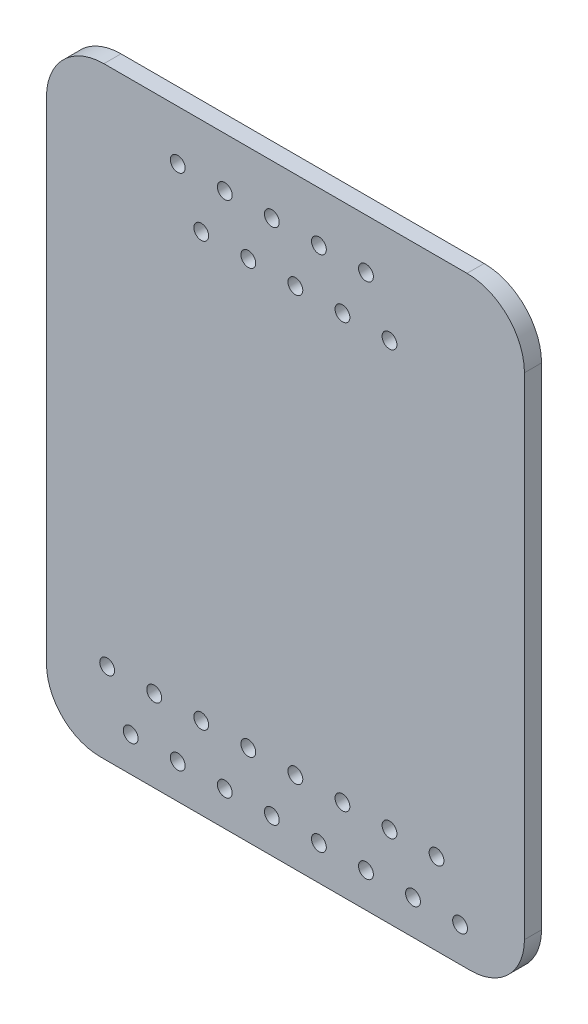
ISO-10303-21;
HEADER;
FILE_DESCRIPTION(('STEP AP214'),'2;1');
FILE_NAME('part.step','',(''),(''),'','','');
FILE_SCHEMA(('AUTOMOTIVE_DESIGN { 1 0 10303 214 1 1 1 1 }'));
ENDSEC;
DATA;
#1=APPLICATION_CONTEXT('core data for automotive mechanical design processes');
#2=APPLICATION_PROTOCOL_DEFINITION('international standard','automotive_design',2000,#1);
#3=PRODUCT_CONTEXT('',#1,'mechanical');
#4=PRODUCT('Part','Part','',(#3));
#5=PRODUCT_RELATED_PRODUCT_CATEGORY('part','',(#4));
#6=PRODUCT_DEFINITION_FORMATION('','',#4);
#7=PRODUCT_DEFINITION_CONTEXT('part definition',#1,'design');
#8=PRODUCT_DEFINITION('design','',#6,#7);
#9=PRODUCT_DEFINITION_SHAPE('','',#8);
#10=(LENGTH_UNIT() NAMED_UNIT(*) SI_UNIT(.MILLI.,.METRE.));
#11=(NAMED_UNIT(*) PLANE_ANGLE_UNIT() SI_UNIT($,.RADIAN.));
#12=(NAMED_UNIT(*) SI_UNIT($,.STERADIAN.) SOLID_ANGLE_UNIT());
#13=UNCERTAINTY_MEASURE_WITH_UNIT(LENGTH_MEASURE(1.E-05),#10,'distance_accuracy_value','');
#14=(GEOMETRIC_REPRESENTATION_CONTEXT(3) GLOBAL_UNCERTAINTY_ASSIGNED_CONTEXT((#13)) GLOBAL_UNIT_ASSIGNED_CONTEXT((#10,
#11,#12)) REPRESENTATION_CONTEXT('',''));
#15=CARTESIAN_POINT('',(0.,0.,0.));
#16=DIRECTION('',(0.,0.,1.));
#17=DIRECTION('',(1.,0.,0.));
#18=AXIS2_PLACEMENT_3D('',#15,#16,#17);
#19=CARTESIAN_POINT('',(6.1,2.9,0.9224));
#20=DIRECTION('',(0.,0.,-1.));
#21=DIRECTION('',(-1.,0.,0.));
#22=AXIS2_PLACEMENT_3D('',#19,#20,#21);
#23=CYLINDRICAL_SURFACE('',#22,2.9);
#24=CARTESIAN_POINT('',(6.1,2.9,0.));
#25=DIRECTION('',(0.,0.,1.));
#26=DIRECTION('',(1.,0.,0.));
#27=AXIS2_PLACEMENT_3D('',#24,#25,#26);
#28=CIRCLE('',#27,2.9);
#29=CARTESIAN_POINT('',(3.2,2.9,0.));
#30=VERTEX_POINT('',#29);
#31=CARTESIAN_POINT('',(6.1,0.,0.));
#32=VERTEX_POINT('',#31);
#33=EDGE_CURVE('E146',#30,#32,#28,.T.);
#34=ORIENTED_EDGE('',*,*,#33,.T.);
#35=DIRECTION('',(0.,0.,-1.));
#36=VECTOR('',#35,1.);
#37=CARTESIAN_POINT('',(6.1,0.,0.9224));
#38=LINE('',#37,#36);
#39=CARTESIAN_POINT('',(6.1,0.,0.9224));
#40=VERTEX_POINT('',#39);
#41=EDGE_CURVE('E11',#40,#32,#38,.T.);
#42=ORIENTED_EDGE('',*,*,#41,.F.);
#43=CARTESIAN_POINT('',(6.1,2.9,0.9224));
#44=DIRECTION('',(0.,0.,1.));
#45=DIRECTION('',(1.,0.,0.));
#46=AXIS2_PLACEMENT_3D('',#43,#44,#45);
#47=CIRCLE('',#46,2.9);
#48=CARTESIAN_POINT('',(3.2,2.9,0.9224));
#49=VERTEX_POINT('',#48);
#50=EDGE_CURVE('E169',#49,#40,#47,.T.);
#51=ORIENTED_EDGE('',*,*,#50,.F.);
#52=DIRECTION('',(0.,0.,-1.));
#53=VECTOR('',#52,1.);
#54=CARTESIAN_POINT('',(3.2,2.9,0.9224));
#55=LINE('',#54,#53);
#56=EDGE_CURVE('E142',#49,#30,#55,.T.);
#57=ORIENTED_EDGE('',*,*,#56,.T.);
#58=EDGE_LOOP('',(#34,#42,#51,#57));
#59=FACE_BOUND('',#58,.T.);
#60=ADVANCED_FACE('F45',(#59),#23,.T.);
#61=CARTESIAN_POINT('',(6.1,0.,0.9224));
#62=DIRECTION('',(0.,1.,0.));
#63=DIRECTION('',(0.,0.,1.));
#64=AXIS2_PLACEMENT_3D('',#61,#62,#63);
#65=PLANE('',#64);
#66=DIRECTION('',(1.,0.,0.));
#67=VECTOR('',#66,1.);
#68=CARTESIAN_POINT('',(6.1,0.,0.));
#69=LINE('',#68,#67);
#70=CARTESIAN_POINT('',(26.1,0.,0.));
#71=VERTEX_POINT('',#70);
#72=EDGE_CURVE('E150',#32,#71,#69,.T.);
#73=ORIENTED_EDGE('',*,*,#72,.T.);
#74=DIRECTION('',(0.,0.,-1.));
#75=VECTOR('',#74,1.);
#76=CARTESIAN_POINT('',(26.1,0.,0.9224));
#77=LINE('',#76,#75);
#78=CARTESIAN_POINT('',(26.1,0.,0.9224));
#79=VERTEX_POINT('',#78);
#80=EDGE_CURVE('E54',#79,#71,#77,.T.);
#81=ORIENTED_EDGE('',*,*,#80,.F.);
#82=DIRECTION('',(1.,0.,0.));
#83=VECTOR('',#82,1.);
#84=CARTESIAN_POINT('',(6.1,0.,0.9224));
#85=LINE('',#84,#83);
#86=EDGE_CURVE('E105',#40,#79,#85,.T.);
#87=ORIENTED_EDGE('',*,*,#86,.F.);
#88=ORIENTED_EDGE('',*,*,#41,.T.);
#89=EDGE_LOOP('',(#73,#81,#87,#88));
#90=FACE_BOUND('',#89,.T.);
#91=ADVANCED_FACE('F490',(#90),#65,.F.);
#92=CARTESIAN_POINT('',(26.10001,2.89998999998276,0.9224));
#93=DIRECTION('',(0.,0.,-1.));
#94=DIRECTION('',(-1.,0.,0.));
#95=AXIS2_PLACEMENT_3D('',#92,#93,#94);
#96=CYLINDRICAL_SURFACE('',#95,2.89999);
#97=CARTESIAN_POINT('',(26.10001,2.89998999998276,0.));
#98=DIRECTION('',(0.,0.,1.));
#99=DIRECTION('',(1.,0.,0.));
#100=AXIS2_PLACEMENT_3D('',#97,#98,#99);
#101=CIRCLE('',#100,2.89999);
#102=CARTESIAN_POINT('',(29.,2.89998999998276,0.));
#103=VERTEX_POINT('',#102);
#104=EDGE_CURVE('E154',#71,#103,#101,.T.);
#105=ORIENTED_EDGE('',*,*,#104,.T.);
#106=DIRECTION('',(0.,0.,-1.));
#107=VECTOR('',#106,1.);
#108=CARTESIAN_POINT('',(29.,2.89998999998276,0.9224));
#109=LINE('',#108,#107);
#110=CARTESIAN_POINT('',(29.,2.89998999998276,0.9224));
#111=VERTEX_POINT('',#110);
#112=EDGE_CURVE('E180',#111,#103,#109,.T.);
#113=ORIENTED_EDGE('',*,*,#112,.F.);
#114=CARTESIAN_POINT('',(26.10001,2.89998999998276,0.9224));
#115=DIRECTION('',(0.,0.,1.));
#116=DIRECTION('',(1.,0.,0.));
#117=AXIS2_PLACEMENT_3D('',#114,#115,#116);
#118=CIRCLE('',#117,2.89999);
#119=EDGE_CURVE('E190',#79,#111,#118,.T.);
#120=ORIENTED_EDGE('',*,*,#119,.F.);
#121=ORIENTED_EDGE('',*,*,#80,.T.);
#122=EDGE_LOOP('',(#105,#113,#120,#121));
#123=FACE_BOUND('',#122,.T.);
#124=ADVANCED_FACE('F188',(#123),#96,.T.);
#125=CARTESIAN_POINT('',(29.,2.89999,0.9224));
#126=DIRECTION('',(-1.,0.,0.));
#127=DIRECTION('',(0.,0.,1.));
#128=AXIS2_PLACEMENT_3D('',#125,#126,#127);
#129=PLANE('',#128);
#130=DIRECTION('',(0.,1.,0.));
#131=VECTOR('',#130,1.);
#132=CARTESIAN_POINT('',(29.,2.89999,0.));
#133=LINE('',#132,#131);
#134=CARTESIAN_POINT('',(29.,29.4,0.));
#135=VERTEX_POINT('',#134);
#136=EDGE_CURVE('E157',#103,#135,#133,.T.);
#137=ORIENTED_EDGE('',*,*,#136,.T.);
#138=DIRECTION('',(0.,0.,-1.));
#139=VECTOR('',#138,1.);
#140=CARTESIAN_POINT('',(29.,29.4,0.9224));
#141=LINE('',#140,#139);
#142=CARTESIAN_POINT('',(29.,29.4,0.9224));
#143=VERTEX_POINT('',#142);
#144=EDGE_CURVE('E176',#143,#135,#141,.T.);
#145=ORIENTED_EDGE('',*,*,#144,.F.);
#146=DIRECTION('',(0.,1.,0.));
#147=VECTOR('',#146,1.);
#148=CARTESIAN_POINT('',(29.,2.89999,0.9224));
#149=LINE('',#148,#147);
#150=EDGE_CURVE('E203',#111,#143,#149,.T.);
#151=ORIENTED_EDGE('',*,*,#150,.F.);
#152=ORIENTED_EDGE('',*,*,#112,.T.);
#153=EDGE_LOOP('',(#137,#145,#151,#152));
#154=FACE_BOUND('',#153,.T.);
#155=ADVANCED_FACE('F198',(#154),#129,.F.);
#156=CARTESIAN_POINT('',(25.9000100000161,29.4000100000161,0.9224));
#157=DIRECTION('',(0.,0.,-1.));
#158=DIRECTION('',(-1.,0.,0.));
#159=AXIS2_PLACEMENT_3D('',#156,#157,#158);
#160=CYLINDRICAL_SURFACE('',#159,3.09999);
#161=CARTESIAN_POINT('',(25.9000100000161,29.4000100000161,0.));
#162=DIRECTION('',(0.,0.,1.));
#163=DIRECTION('',(1.,0.,0.));
#164=AXIS2_PLACEMENT_3D('',#161,#162,#163);
#165=CIRCLE('',#164,3.09999);
#166=CARTESIAN_POINT('',(25.9,32.5,0.));
#167=VERTEX_POINT('',#166);
#168=EDGE_CURVE('E160',#135,#167,#165,.T.);
#169=ORIENTED_EDGE('',*,*,#168,.T.);
#170=DIRECTION('',(0.,0.,-1.));
#171=VECTOR('',#170,1.);
#172=CARTESIAN_POINT('',(25.9,32.5,0.9224));
#173=LINE('',#172,#171);
#174=CARTESIAN_POINT('',(25.9,32.5,0.9224));
#175=VERTEX_POINT('',#174);
#176=EDGE_CURVE('E135',#175,#167,#173,.T.);
#177=ORIENTED_EDGE('',*,*,#176,.F.);
#178=CARTESIAN_POINT('',(25.9000100000161,29.4000100000161,0.9224));
#179=DIRECTION('',(0.,0.,1.));
#180=DIRECTION('',(1.,0.,0.));
#181=AXIS2_PLACEMENT_3D('',#178,#179,#180);
#182=CIRCLE('',#181,3.09999);
#183=EDGE_CURVE('E124',#143,#175,#182,.T.);
#184=ORIENTED_EDGE('',*,*,#183,.F.);
#185=ORIENTED_EDGE('',*,*,#144,.T.);
#186=EDGE_LOOP('',(#169,#177,#184,#185));
#187=FACE_BOUND('',#186,.T.);
#188=ADVANCED_FACE('F201',(#187),#160,.T.);
#189=CARTESIAN_POINT('',(25.9,32.5,0.9224));
#190=DIRECTION('',(5.10203821409991E-07,-0.99999999999987,0.));
#191=DIRECTION('',(0.99999999999987,5.10203821409991E-07,0.));
#192=AXIS2_PLACEMENT_3D('',#189,#190,#191);
#193=PLANE('',#192);
#194=DIRECTION('',(-0.99999999999987,-5.10203821409991E-07,0.));
#195=VECTOR('',#194,1.);
#196=CARTESIAN_POINT('',(25.9,32.5,0.));
#197=LINE('',#196,#195);
#198=CARTESIAN_POINT('',(6.29999,32.49999,0.));
#199=VERTEX_POINT('',#198);
#200=EDGE_CURVE('E133',#167,#199,#197,.T.);
#201=ORIENTED_EDGE('',*,*,#200,.T.);
#202=DIRECTION('',(0.,0.,-1.));
#203=VECTOR('',#202,1.);
#204=CARTESIAN_POINT('',(6.29999,32.49999,0.9224));
#205=LINE('',#204,#203);
#206=CARTESIAN_POINT('',(6.29999,32.49999,0.9224));
#207=VERTEX_POINT('',#206);
#208=EDGE_CURVE('E130',#207,#199,#205,.T.);
#209=ORIENTED_EDGE('',*,*,#208,.F.);
#210=DIRECTION('',(-0.99999999999987,-5.10203821409991E-07,0.));
#211=VECTOR('',#210,1.);
#212=CARTESIAN_POINT('',(25.9,32.5,0.9224));
#213=LINE('',#212,#211);
#214=EDGE_CURVE('E118',#175,#207,#213,.T.);
#215=ORIENTED_EDGE('',*,*,#214,.F.);
#216=ORIENTED_EDGE('',*,*,#176,.T.);
#217=EDGE_LOOP('',(#201,#209,#215,#216));
#218=FACE_BOUND('',#217,.T.);
#219=ADVANCED_FACE('F131',(#218),#193,.F.);
#220=CARTESIAN_POINT('',(6.29995999985483,29.4000300001452,0.9224));
#221=DIRECTION('',(0.,0.,-1.));
#222=DIRECTION('',(-1.,0.,0.));
#223=AXIS2_PLACEMENT_3D('',#220,#221,#222);
#224=CYLINDRICAL_SURFACE('',#223,3.09996);
#225=CARTESIAN_POINT('',(6.29995999985483,29.4000300001452,0.));
#226=DIRECTION('',(0.,0.,1.));
#227=DIRECTION('',(1.,0.,0.));
#228=AXIS2_PLACEMENT_3D('',#225,#226,#227);
#229=CIRCLE('',#228,3.09996);
#230=CARTESIAN_POINT('',(3.2,29.4,0.));
#231=VERTEX_POINT('',#230);
#232=EDGE_CURVE('E91',#199,#231,#229,.T.);
#233=ORIENTED_EDGE('',*,*,#232,.T.);
#234=DIRECTION('',(0.,0.,-1.));
#235=VECTOR('',#234,1.);
#236=CARTESIAN_POINT('',(3.2,29.4,0.9224));
#237=LINE('',#236,#235);
#238=CARTESIAN_POINT('',(3.2,29.4,0.9224));
#239=VERTEX_POINT('',#238);
#240=EDGE_CURVE('E136',#239,#231,#237,.T.);
#241=ORIENTED_EDGE('',*,*,#240,.F.);
#242=CARTESIAN_POINT('',(6.29995999985483,29.4000300001452,0.9224));
#243=DIRECTION('',(0.,0.,1.));
#244=DIRECTION('',(1.,0.,0.));
#245=AXIS2_PLACEMENT_3D('',#242,#243,#244);
#246=CIRCLE('',#245,3.09996);
#247=EDGE_CURVE('E122',#207,#239,#246,.T.);
#248=ORIENTED_EDGE('',*,*,#247,.F.);
#249=ORIENTED_EDGE('',*,*,#208,.T.);
#250=EDGE_LOOP('',(#233,#241,#248,#249));
#251=FACE_BOUND('',#250,.T.);
#252=ADVANCED_FACE('F138',(#251),#224,.T.);
#253=CARTESIAN_POINT('',(3.2,29.4,0.9224));
#254=DIRECTION('',(1.,0.,0.));
#255=DIRECTION('',(0.,0.,-1.));
#256=AXIS2_PLACEMENT_3D('',#253,#254,#255);
#257=PLANE('',#256);
#258=DIRECTION('',(0.,-1.,0.));
#259=VECTOR('',#258,1.);
#260=CARTESIAN_POINT('',(3.2,29.4,0.));
#261=LINE('',#260,#259);
#262=EDGE_CURVE('E97',#231,#30,#261,.T.);
#263=ORIENTED_EDGE('',*,*,#262,.T.);
#264=ORIENTED_EDGE('',*,*,#56,.F.);
#265=DIRECTION('',(0.,-1.,0.));
#266=VECTOR('',#265,1.);
#267=CARTESIAN_POINT('',(3.2,29.4,0.9224));
#268=LINE('',#267,#266);
#269=EDGE_CURVE('E62',#239,#49,#268,.T.);
#270=ORIENTED_EDGE('',*,*,#269,.F.);
#271=ORIENTED_EDGE('',*,*,#240,.T.);
#272=EDGE_LOOP('',(#263,#264,#270,#271));
#273=FACE_BOUND('',#272,.T.);
#274=ADVANCED_FACE('F497',(#273),#257,.F.);
#275=CARTESIAN_POINT('',(6.1,2.9,0.9224));
#276=DIRECTION('',(0.,0.,1.));
#277=DIRECTION('',(1.,0.,0.));
#278=AXIS2_PLACEMENT_3D('',#275,#276,#277);
#279=PLANE('',#278);
#280=CARTESIAN_POINT('',(15.36548,29.8099,0.922400000000004));
#281=DIRECTION('',(0.,0.,-1.));
#282=DIRECTION('',(-1.,0.,0.));
#283=AXIS2_PLACEMENT_3D('',#280,#281,#282);
#284=CIRCLE('',#283,0.399999999999987);
#285=CARTESIAN_POINT('',(14.96548,29.8099,0.922400000000004));
#286=VERTEX_POINT('',#285);
#287=EDGE_CURVE('E412',#286,#286,#284,.T.);
#288=ORIENTED_EDGE('',*,*,#287,.T.);
#289=EDGE_LOOP('',(#288));
#290=FACE_BOUND('',#289,.T.);
#291=CARTESIAN_POINT('',(16.63548,27.2699,0.922400000000004));
#292=DIRECTION('',(0.,0.,-1.));
#293=DIRECTION('',(-1.,0.,0.));
#294=AXIS2_PLACEMENT_3D('',#291,#292,#293);
#295=CIRCLE('',#294,0.399999999999987);
#296=CARTESIAN_POINT('',(16.23548,27.2699,0.922400000000004));
#297=VERTEX_POINT('',#296);
#298=EDGE_CURVE('E404',#297,#297,#295,.T.);
#299=ORIENTED_EDGE('',*,*,#298,.T.);
#300=EDGE_LOOP('',(#299));
#301=FACE_BOUND('',#300,.T.);
#302=CARTESIAN_POINT('',(17.90548,29.8099,0.922400000000004));
#303=DIRECTION('',(0.,0.,-1.));
#304=DIRECTION('',(-1.,0.,0.));
#305=AXIS2_PLACEMENT_3D('',#302,#303,#304);
#306=CIRCLE('',#305,0.399999999999987);
#307=CARTESIAN_POINT('',(17.50548,29.8099,0.922400000000004));
#308=VERTEX_POINT('',#307);
#309=EDGE_CURVE('E396',#308,#308,#306,.T.);
#310=ORIENTED_EDGE('',*,*,#309,.T.);
#311=EDGE_LOOP('',(#310));
#312=FACE_BOUND('',#311,.T.);
#313=CARTESIAN_POINT('',(19.17548,27.2699,0.922400000000004));
#314=DIRECTION('',(0.,0.,-1.));
#315=DIRECTION('',(-1.,0.,0.));
#316=AXIS2_PLACEMENT_3D('',#313,#314,#315);
#317=CIRCLE('',#316,0.399999999999987);
#318=CARTESIAN_POINT('',(18.77548,27.2699,0.922400000000004));
#319=VERTEX_POINT('',#318);
#320=EDGE_CURVE('E388',#319,#319,#317,.T.);
#321=ORIENTED_EDGE('',*,*,#320,.T.);
#322=EDGE_LOOP('',(#321));
#323=FACE_BOUND('',#322,.T.);
#324=CARTESIAN_POINT('',(21.71548,27.2699,0.922400000000004));
#325=DIRECTION('',(0.,0.,-1.));
#326=DIRECTION('',(-1.,0.,0.));
#327=AXIS2_PLACEMENT_3D('',#324,#325,#326);
#328=CIRCLE('',#327,0.399999999999987);
#329=CARTESIAN_POINT('',(21.31548,27.2699,0.922400000000004));
#330=VERTEX_POINT('',#329);
#331=EDGE_CURVE('E380',#330,#330,#328,.T.);
#332=ORIENTED_EDGE('',*,*,#331,.T.);
#333=EDGE_LOOP('',(#332));
#334=FACE_BOUND('',#333,.T.);
#335=CARTESIAN_POINT('',(20.44548,29.8099,0.922400000000004));
#336=DIRECTION('',(0.,0.,-1.));
#337=DIRECTION('',(-1.,0.,0.));
#338=AXIS2_PLACEMENT_3D('',#335,#336,#337);
#339=CIRCLE('',#338,0.399999999999987);
#340=CARTESIAN_POINT('',(20.04548,29.8099,0.922400000000004));
#341=VERTEX_POINT('',#340);
#342=EDGE_CURVE('E372',#341,#341,#339,.T.);
#343=ORIENTED_EDGE('',*,*,#342,.T.);
#344=EDGE_LOOP('',(#343));
#345=FACE_BOUND('',#344,.T.);
#346=CARTESIAN_POINT('',(14.09548,27.2699,0.922400000000004));
#347=DIRECTION('',(0.,0.,-1.));
#348=DIRECTION('',(-1.,0.,0.));
#349=AXIS2_PLACEMENT_3D('',#346,#347,#348);
#350=CIRCLE('',#349,0.399999999999987);
#351=CARTESIAN_POINT('',(13.69548,27.2699,0.922400000000004));
#352=VERTEX_POINT('',#351);
#353=EDGE_CURVE('E364',#352,#352,#350,.T.);
#354=ORIENTED_EDGE('',*,*,#353,.T.);
#355=EDGE_LOOP('',(#354));
#356=FACE_BOUND('',#355,.T.);
#357=CARTESIAN_POINT('',(11.55548,27.2699,0.922400000000004));
#358=DIRECTION('',(0.,0.,-1.));
#359=DIRECTION('',(-1.,0.,0.));
#360=AXIS2_PLACEMENT_3D('',#357,#358,#359);
#361=CIRCLE('',#360,0.399999999999987);
#362=CARTESIAN_POINT('',(11.15548,27.2699,0.922400000000004));
#363=VERTEX_POINT('',#362);
#364=EDGE_CURVE('E356',#363,#363,#361,.T.);
#365=ORIENTED_EDGE('',*,*,#364,.T.);
#366=EDGE_LOOP('',(#365));
#367=FACE_BOUND('',#366,.T.);
#368=CARTESIAN_POINT('',(12.82548,29.8099,0.922400000000004));
#369=DIRECTION('',(0.,0.,-1.));
#370=DIRECTION('',(-1.,0.,0.));
#371=AXIS2_PLACEMENT_3D('',#368,#369,#370);
#372=CIRCLE('',#371,0.399999999999987);
#373=CARTESIAN_POINT('',(12.42548,29.8099,0.922400000000004));
#374=VERTEX_POINT('',#373);
#375=EDGE_CURVE('E348',#374,#374,#372,.T.);
#376=ORIENTED_EDGE('',*,*,#375,.T.);
#377=EDGE_LOOP('',(#376));
#378=FACE_BOUND('',#377,.T.);
#379=CARTESIAN_POINT('',(10.28548,29.8099,0.922400000000004));
#380=DIRECTION('',(0.,0.,-1.));
#381=DIRECTION('',(-1.,0.,0.));
#382=AXIS2_PLACEMENT_3D('',#379,#380,#381);
#383=CIRCLE('',#382,0.399999999999987);
#384=CARTESIAN_POINT('',(9.88548000000001,29.8099,0.922400000000004));
#385=VERTEX_POINT('',#384);
#386=EDGE_CURVE('E340',#385,#385,#383,.T.);
#387=ORIENTED_EDGE('',*,*,#386,.T.);
#388=EDGE_LOOP('',(#387));
#389=FACE_BOUND('',#388,.T.);
#390=CARTESIAN_POINT('',(25.52548,1.86993,0.922400000000004));
#391=DIRECTION('',(0.,0.,-1.));
#392=DIRECTION('',(-1.,0.,0.));
#393=AXIS2_PLACEMENT_3D('',#390,#391,#392);
#394=CIRCLE('',#393,0.399999999999987);
#395=CARTESIAN_POINT('',(25.12548,1.86993,0.922400000000004));
#396=VERTEX_POINT('',#395);
#397=EDGE_CURVE('E332',#396,#396,#394,.T.);
#398=ORIENTED_EDGE('',*,*,#397,.T.);
#399=EDGE_LOOP('',(#398));
#400=FACE_BOUND('',#399,.T.);
#401=CARTESIAN_POINT('',(21.71548,4.40993,0.922400000000004));
#402=DIRECTION('',(0.,0.,-1.));
#403=DIRECTION('',(-1.,0.,0.));
#404=AXIS2_PLACEMENT_3D('',#401,#402,#403);
#405=CIRCLE('',#404,0.399999999999987);
#406=CARTESIAN_POINT('',(21.31548,4.40993,0.922400000000004));
#407=VERTEX_POINT('',#406);
#408=EDGE_CURVE('E324',#407,#407,#405,.T.);
#409=ORIENTED_EDGE('',*,*,#408,.T.);
#410=EDGE_LOOP('',(#409));
#411=FACE_BOUND('',#410,.T.);
#412=CARTESIAN_POINT('',(17.90548,1.86993,0.922400000000004));
#413=DIRECTION('',(0.,0.,-1.));
#414=DIRECTION('',(-1.,0.,0.));
#415=AXIS2_PLACEMENT_3D('',#412,#413,#414);
#416=CIRCLE('',#415,0.399999999999987);
#417=CARTESIAN_POINT('',(17.50548,1.86993,0.922400000000004));
#418=VERTEX_POINT('',#417);
#419=EDGE_CURVE('E316',#418,#418,#416,.T.);
#420=ORIENTED_EDGE('',*,*,#419,.T.);
#421=EDGE_LOOP('',(#420));
#422=FACE_BOUND('',#421,.T.);
#423=CARTESIAN_POINT('',(15.36548,1.86993,0.922400000000004));
#424=DIRECTION('',(0.,0.,-1.));
#425=DIRECTION('',(-1.,0.,0.));
#426=AXIS2_PLACEMENT_3D('',#423,#424,#425);
#427=CIRCLE('',#426,0.399999999999987);
#428=CARTESIAN_POINT('',(14.96548,1.86993,0.922400000000004));
#429=VERTEX_POINT('',#428);
#430=EDGE_CURVE('E308',#429,#429,#427,.T.);
#431=ORIENTED_EDGE('',*,*,#430,.T.);
#432=EDGE_LOOP('',(#431));
#433=FACE_BOUND('',#432,.T.);
#434=CARTESIAN_POINT('',(19.17548,4.40993,0.922400000000004));
#435=DIRECTION('',(0.,0.,-1.));
#436=DIRECTION('',(-1.,0.,0.));
#437=AXIS2_PLACEMENT_3D('',#434,#435,#436);
#438=CIRCLE('',#437,0.399999999999987);
#439=CARTESIAN_POINT('',(18.77548,4.40993,0.922400000000004));
#440=VERTEX_POINT('',#439);
#441=EDGE_CURVE('E300',#440,#440,#438,.T.);
#442=ORIENTED_EDGE('',*,*,#441,.T.);
#443=EDGE_LOOP('',(#442));
#444=FACE_BOUND('',#443,.T.);
#445=CARTESIAN_POINT('',(16.63548,4.40993,0.922400000000004));
#446=DIRECTION('',(0.,0.,-1.));
#447=DIRECTION('',(-1.,0.,0.));
#448=AXIS2_PLACEMENT_3D('',#445,#446,#447);
#449=CIRCLE('',#448,0.399999999999987);
#450=CARTESIAN_POINT('',(16.23548,4.40993,0.922400000000004));
#451=VERTEX_POINT('',#450);
#452=EDGE_CURVE('E292',#451,#451,#449,.T.);
#453=ORIENTED_EDGE('',*,*,#452,.T.);
#454=EDGE_LOOP('',(#453));
#455=FACE_BOUND('',#454,.T.);
#456=CARTESIAN_POINT('',(22.98548,1.86993,0.922400000000004));
#457=DIRECTION('',(0.,0.,-1.));
#458=DIRECTION('',(-1.,0.,0.));
#459=AXIS2_PLACEMENT_3D('',#456,#457,#458);
#460=CIRCLE('',#459,0.399999999999987);
#461=CARTESIAN_POINT('',(22.58548,1.86993,0.922400000000004));
#462=VERTEX_POINT('',#461);
#463=EDGE_CURVE('E284',#462,#462,#460,.T.);
#464=ORIENTED_EDGE('',*,*,#463,.T.);
#465=EDGE_LOOP('',(#464));
#466=FACE_BOUND('',#465,.T.);
#467=CARTESIAN_POINT('',(20.44548,1.86993,0.922400000000004));
#468=DIRECTION('',(0.,0.,-1.));
#469=DIRECTION('',(-1.,0.,0.));
#470=AXIS2_PLACEMENT_3D('',#467,#468,#469);
#471=CIRCLE('',#470,0.399999999999987);
#472=CARTESIAN_POINT('',(20.04548,1.86993,0.922400000000004));
#473=VERTEX_POINT('',#472);
#474=EDGE_CURVE('E276',#473,#473,#471,.T.);
#475=ORIENTED_EDGE('',*,*,#474,.T.);
#476=EDGE_LOOP('',(#475));
#477=FACE_BOUND('',#476,.T.);
#478=CARTESIAN_POINT('',(24.25548,4.40993,0.922400000000004));
#479=DIRECTION('',(0.,0.,-1.));
#480=DIRECTION('',(-1.,0.,0.));
#481=AXIS2_PLACEMENT_3D('',#478,#479,#480);
#482=CIRCLE('',#481,0.399999999999987);
#483=CARTESIAN_POINT('',(23.85548,4.40993,0.922400000000004));
#484=VERTEX_POINT('',#483);
#485=EDGE_CURVE('E268',#484,#484,#482,.T.);
#486=ORIENTED_EDGE('',*,*,#485,.T.);
#487=EDGE_LOOP('',(#486));
#488=FACE_BOUND('',#487,.T.);
#489=CARTESIAN_POINT('',(14.09548,4.40993,0.922400000000004));
#490=DIRECTION('',(0.,0.,-1.));
#491=DIRECTION('',(-1.,0.,0.));
#492=AXIS2_PLACEMENT_3D('',#489,#490,#491);
#493=CIRCLE('',#492,0.399999999999987);
#494=CARTESIAN_POINT('',(13.69548,4.40993,0.922400000000004));
#495=VERTEX_POINT('',#494);
#496=EDGE_CURVE('E260',#495,#495,#493,.T.);
#497=ORIENTED_EDGE('',*,*,#496,.T.);
#498=EDGE_LOOP('',(#497));
#499=FACE_BOUND('',#498,.T.);
#500=CARTESIAN_POINT('',(12.82548,1.86993,0.922400000000004));
#501=DIRECTION('',(0.,0.,-1.));
#502=DIRECTION('',(-1.,0.,0.));
#503=AXIS2_PLACEMENT_3D('',#500,#501,#502);
#504=CIRCLE('',#503,0.399999999999987);
#505=CARTESIAN_POINT('',(12.42548,1.86993,0.922400000000004));
#506=VERTEX_POINT('',#505);
#507=EDGE_CURVE('E252',#506,#506,#504,.T.);
#508=ORIENTED_EDGE('',*,*,#507,.T.);
#509=EDGE_LOOP('',(#508));
#510=FACE_BOUND('',#509,.T.);
#511=CARTESIAN_POINT('',(11.55548,4.40993,0.922400000000004));
#512=DIRECTION('',(0.,0.,-1.));
#513=DIRECTION('',(-1.,0.,0.));
#514=AXIS2_PLACEMENT_3D('',#511,#512,#513);
#515=CIRCLE('',#514,0.399999999999987);
#516=CARTESIAN_POINT('',(11.15548,4.40993,0.922400000000004));
#517=VERTEX_POINT('',#516);
#518=EDGE_CURVE('E244',#517,#517,#515,.T.);
#519=ORIENTED_EDGE('',*,*,#518,.T.);
#520=EDGE_LOOP('',(#519));
#521=FACE_BOUND('',#520,.T.);
#522=CARTESIAN_POINT('',(7.74548,1.86993,0.922400000000004));
#523=DIRECTION('',(0.,0.,-1.));
#524=DIRECTION('',(-1.,0.,0.));
#525=AXIS2_PLACEMENT_3D('',#522,#523,#524);
#526=CIRCLE('',#525,0.399999999999988);
#527=CARTESIAN_POINT('',(7.34548000000001,1.86993,0.922400000000004));
#528=VERTEX_POINT('',#527);
#529=EDGE_CURVE('E236',#528,#528,#526,.T.);
#530=ORIENTED_EDGE('',*,*,#529,.T.);
#531=EDGE_LOOP('',(#530));
#532=FACE_BOUND('',#531,.T.);
#533=CARTESIAN_POINT('',(6.47548,4.40993,0.922400000000004));
#534=DIRECTION('',(0.,0.,-1.));
#535=DIRECTION('',(-1.,0.,0.));
#536=AXIS2_PLACEMENT_3D('',#533,#534,#535);
#537=CIRCLE('',#536,0.399999999999987);
#538=CARTESIAN_POINT('',(6.07548000000001,4.40993,0.922400000000004));
#539=VERTEX_POINT('',#538);
#540=EDGE_CURVE('E228',#539,#539,#537,.T.);
#541=ORIENTED_EDGE('',*,*,#540,.T.);
#542=EDGE_LOOP('',(#541));
#543=FACE_BOUND('',#542,.T.);
#544=CARTESIAN_POINT('',(9.01548,4.40993,0.922400000000004));
#545=DIRECTION('',(0.,0.,-1.));
#546=DIRECTION('',(-1.,0.,0.));
#547=AXIS2_PLACEMENT_3D('',#544,#545,#546);
#548=CIRCLE('',#547,0.399999999999987);
#549=CARTESIAN_POINT('',(8.61548000000001,4.40993,0.922400000000004));
#550=VERTEX_POINT('',#549);
#551=EDGE_CURVE('E220',#550,#550,#548,.T.);
#552=ORIENTED_EDGE('',*,*,#551,.T.);
#553=EDGE_LOOP('',(#552));
#554=FACE_BOUND('',#553,.T.);
#555=CARTESIAN_POINT('',(10.28548,1.86993,0.922400000000004));
#556=DIRECTION('',(0.,0.,-1.));
#557=DIRECTION('',(-1.,0.,0.));
#558=AXIS2_PLACEMENT_3D('',#555,#556,#557);
#559=CIRCLE('',#558,0.399999999999987);
#560=CARTESIAN_POINT('',(9.88548000000001,1.86993,0.922400000000004));
#561=VERTEX_POINT('',#560);
#562=EDGE_CURVE('E151',#561,#561,#559,.T.);
#563=ORIENTED_EDGE('',*,*,#562,.T.);
#564=EDGE_LOOP('',(#563));
#565=FACE_BOUND('',#564,.T.);
#566=ORIENTED_EDGE('',*,*,#50,.T.);
#567=ORIENTED_EDGE('',*,*,#86,.T.);
#568=ORIENTED_EDGE('',*,*,#119,.T.);
#569=ORIENTED_EDGE('',*,*,#150,.T.);
#570=ORIENTED_EDGE('',*,*,#183,.T.);
#571=ORIENTED_EDGE('',*,*,#214,.T.);
#572=ORIENTED_EDGE('',*,*,#247,.T.);
#573=ORIENTED_EDGE('',*,*,#269,.T.);
#574=EDGE_LOOP('',(#566,#567,#568,#569,#570,#571,#572,#573));
#575=FACE_BOUND('',#574,.T.);
#576=ADVANCED_FACE('F120',(#290,#301,#312,#323,#334,#345,#356,#367,#378,#389,#400,#411,#422,
#433,#444,#455,#466,#477,#488,#499,#510,#521,#532,#543,#554,#565,#575),#279,.T.);
#577=CARTESIAN_POINT('',(6.1,2.9,0.));
#578=DIRECTION('',(0.,0.,1.));
#579=DIRECTION('',(1.,0.,0.));
#580=AXIS2_PLACEMENT_3D('',#577,#578,#579);
#581=PLANE('',#580);
#582=CARTESIAN_POINT('',(15.36548,29.8099,0.));
#583=DIRECTION('',(0.,0.,-1.));
#584=DIRECTION('',(-1.,0.,0.));
#585=AXIS2_PLACEMENT_3D('',#582,#583,#584);
#586=CIRCLE('',#585,0.399999999999987);
#587=CARTESIAN_POINT('',(14.96548,29.8099,0.));
#588=VERTEX_POINT('',#587);
#589=EDGE_CURVE('E416',#588,#588,#586,.T.);
#590=ORIENTED_EDGE('',*,*,#589,.F.);
#591=EDGE_LOOP('',(#590));
#592=FACE_BOUND('',#591,.T.);
#593=CARTESIAN_POINT('',(16.63548,27.2699,0.));
#594=DIRECTION('',(0.,0.,-1.));
#595=DIRECTION('',(-1.,0.,0.));
#596=AXIS2_PLACEMENT_3D('',#593,#594,#595);
#597=CIRCLE('',#596,0.399999999999987);
#598=CARTESIAN_POINT('',(16.23548,27.2699,0.));
#599=VERTEX_POINT('',#598);
#600=EDGE_CURVE('E408',#599,#599,#597,.T.);
#601=ORIENTED_EDGE('',*,*,#600,.F.);
#602=EDGE_LOOP('',(#601));
#603=FACE_BOUND('',#602,.T.);
#604=CARTESIAN_POINT('',(17.90548,29.8099,0.));
#605=DIRECTION('',(0.,0.,-1.));
#606=DIRECTION('',(-1.,0.,0.));
#607=AXIS2_PLACEMENT_3D('',#604,#605,#606);
#608=CIRCLE('',#607,0.399999999999987);
#609=CARTESIAN_POINT('',(17.50548,29.8099,0.));
#610=VERTEX_POINT('',#609);
#611=EDGE_CURVE('E400',#610,#610,#608,.T.);
#612=ORIENTED_EDGE('',*,*,#611,.F.);
#613=EDGE_LOOP('',(#612));
#614=FACE_BOUND('',#613,.T.);
#615=CARTESIAN_POINT('',(19.17548,27.2699,0.));
#616=DIRECTION('',(0.,0.,-1.));
#617=DIRECTION('',(-1.,0.,0.));
#618=AXIS2_PLACEMENT_3D('',#615,#616,#617);
#619=CIRCLE('',#618,0.399999999999987);
#620=CARTESIAN_POINT('',(18.77548,27.2699,0.));
#621=VERTEX_POINT('',#620);
#622=EDGE_CURVE('E392',#621,#621,#619,.T.);
#623=ORIENTED_EDGE('',*,*,#622,.F.);
#624=EDGE_LOOP('',(#623));
#625=FACE_BOUND('',#624,.T.);
#626=CARTESIAN_POINT('',(21.71548,27.2699,0.));
#627=DIRECTION('',(0.,0.,-1.));
#628=DIRECTION('',(-1.,0.,0.));
#629=AXIS2_PLACEMENT_3D('',#626,#627,#628);
#630=CIRCLE('',#629,0.399999999999987);
#631=CARTESIAN_POINT('',(21.31548,27.2699,0.));
#632=VERTEX_POINT('',#631);
#633=EDGE_CURVE('E384',#632,#632,#630,.T.);
#634=ORIENTED_EDGE('',*,*,#633,.F.);
#635=EDGE_LOOP('',(#634));
#636=FACE_BOUND('',#635,.T.);
#637=CARTESIAN_POINT('',(20.44548,29.8099,0.));
#638=DIRECTION('',(0.,0.,-1.));
#639=DIRECTION('',(-1.,0.,0.));
#640=AXIS2_PLACEMENT_3D('',#637,#638,#639);
#641=CIRCLE('',#640,0.399999999999987);
#642=CARTESIAN_POINT('',(20.04548,29.8099,0.));
#643=VERTEX_POINT('',#642);
#644=EDGE_CURVE('E376',#643,#643,#641,.T.);
#645=ORIENTED_EDGE('',*,*,#644,.F.);
#646=EDGE_LOOP('',(#645));
#647=FACE_BOUND('',#646,.T.);
#648=CARTESIAN_POINT('',(14.09548,27.2699,0.));
#649=DIRECTION('',(0.,0.,-1.));
#650=DIRECTION('',(-1.,0.,0.));
#651=AXIS2_PLACEMENT_3D('',#648,#649,#650);
#652=CIRCLE('',#651,0.399999999999987);
#653=CARTESIAN_POINT('',(13.69548,27.2699,0.));
#654=VERTEX_POINT('',#653);
#655=EDGE_CURVE('E368',#654,#654,#652,.T.);
#656=ORIENTED_EDGE('',*,*,#655,.F.);
#657=EDGE_LOOP('',(#656));
#658=FACE_BOUND('',#657,.T.);
#659=CARTESIAN_POINT('',(11.55548,27.2699,0.));
#660=DIRECTION('',(0.,0.,-1.));
#661=DIRECTION('',(-1.,0.,0.));
#662=AXIS2_PLACEMENT_3D('',#659,#660,#661);
#663=CIRCLE('',#662,0.399999999999987);
#664=CARTESIAN_POINT('',(11.15548,27.2699,0.));
#665=VERTEX_POINT('',#664);
#666=EDGE_CURVE('E360',#665,#665,#663,.T.);
#667=ORIENTED_EDGE('',*,*,#666,.F.);
#668=EDGE_LOOP('',(#667));
#669=FACE_BOUND('',#668,.T.);
#670=CARTESIAN_POINT('',(12.82548,29.8099,0.));
#671=DIRECTION('',(0.,0.,-1.));
#672=DIRECTION('',(-1.,0.,0.));
#673=AXIS2_PLACEMENT_3D('',#670,#671,#672);
#674=CIRCLE('',#673,0.399999999999987);
#675=CARTESIAN_POINT('',(12.42548,29.8099,0.));
#676=VERTEX_POINT('',#675);
#677=EDGE_CURVE('E352',#676,#676,#674,.T.);
#678=ORIENTED_EDGE('',*,*,#677,.F.);
#679=EDGE_LOOP('',(#678));
#680=FACE_BOUND('',#679,.T.);
#681=CARTESIAN_POINT('',(10.28548,29.8099,0.));
#682=DIRECTION('',(0.,0.,-1.));
#683=DIRECTION('',(-1.,0.,0.));
#684=AXIS2_PLACEMENT_3D('',#681,#682,#683);
#685=CIRCLE('',#684,0.399999999999987);
#686=CARTESIAN_POINT('',(9.88548000000001,29.8099,0.));
#687=VERTEX_POINT('',#686);
#688=EDGE_CURVE('E344',#687,#687,#685,.T.);
#689=ORIENTED_EDGE('',*,*,#688,.F.);
#690=EDGE_LOOP('',(#689));
#691=FACE_BOUND('',#690,.T.);
#692=CARTESIAN_POINT('',(25.52548,1.86993,0.));
#693=DIRECTION('',(0.,0.,-1.));
#694=DIRECTION('',(-1.,0.,0.));
#695=AXIS2_PLACEMENT_3D('',#692,#693,#694);
#696=CIRCLE('',#695,0.399999999999987);
#697=CARTESIAN_POINT('',(25.12548,1.86993,0.));
#698=VERTEX_POINT('',#697);
#699=EDGE_CURVE('E336',#698,#698,#696,.T.);
#700=ORIENTED_EDGE('',*,*,#699,.F.);
#701=EDGE_LOOP('',(#700));
#702=FACE_BOUND('',#701,.T.);
#703=CARTESIAN_POINT('',(21.71548,4.40993,0.));
#704=DIRECTION('',(0.,0.,-1.));
#705=DIRECTION('',(-1.,0.,0.));
#706=AXIS2_PLACEMENT_3D('',#703,#704,#705);
#707=CIRCLE('',#706,0.399999999999987);
#708=CARTESIAN_POINT('',(21.31548,4.40993,0.));
#709=VERTEX_POINT('',#708);
#710=EDGE_CURVE('E328',#709,#709,#707,.T.);
#711=ORIENTED_EDGE('',*,*,#710,.F.);
#712=EDGE_LOOP('',(#711));
#713=FACE_BOUND('',#712,.T.);
#714=CARTESIAN_POINT('',(17.90548,1.86993,0.));
#715=DIRECTION('',(0.,0.,-1.));
#716=DIRECTION('',(-1.,0.,0.));
#717=AXIS2_PLACEMENT_3D('',#714,#715,#716);
#718=CIRCLE('',#717,0.399999999999987);
#719=CARTESIAN_POINT('',(17.50548,1.86993,0.));
#720=VERTEX_POINT('',#719);
#721=EDGE_CURVE('E320',#720,#720,#718,.T.);
#722=ORIENTED_EDGE('',*,*,#721,.F.);
#723=EDGE_LOOP('',(#722));
#724=FACE_BOUND('',#723,.T.);
#725=CARTESIAN_POINT('',(15.36548,1.86993,0.));
#726=DIRECTION('',(0.,0.,-1.));
#727=DIRECTION('',(-1.,0.,0.));
#728=AXIS2_PLACEMENT_3D('',#725,#726,#727);
#729=CIRCLE('',#728,0.399999999999987);
#730=CARTESIAN_POINT('',(14.96548,1.86993,0.));
#731=VERTEX_POINT('',#730);
#732=EDGE_CURVE('E312',#731,#731,#729,.T.);
#733=ORIENTED_EDGE('',*,*,#732,.F.);
#734=EDGE_LOOP('',(#733));
#735=FACE_BOUND('',#734,.T.);
#736=CARTESIAN_POINT('',(19.17548,4.40993,0.));
#737=DIRECTION('',(0.,0.,-1.));
#738=DIRECTION('',(-1.,0.,0.));
#739=AXIS2_PLACEMENT_3D('',#736,#737,#738);
#740=CIRCLE('',#739,0.399999999999987);
#741=CARTESIAN_POINT('',(18.77548,4.40993,0.));
#742=VERTEX_POINT('',#741);
#743=EDGE_CURVE('E304',#742,#742,#740,.T.);
#744=ORIENTED_EDGE('',*,*,#743,.F.);
#745=EDGE_LOOP('',(#744));
#746=FACE_BOUND('',#745,.T.);
#747=CARTESIAN_POINT('',(16.63548,4.40993,0.));
#748=DIRECTION('',(0.,0.,-1.));
#749=DIRECTION('',(-1.,0.,0.));
#750=AXIS2_PLACEMENT_3D('',#747,#748,#749);
#751=CIRCLE('',#750,0.399999999999987);
#752=CARTESIAN_POINT('',(16.23548,4.40993,0.));
#753=VERTEX_POINT('',#752);
#754=EDGE_CURVE('E296',#753,#753,#751,.T.);
#755=ORIENTED_EDGE('',*,*,#754,.F.);
#756=EDGE_LOOP('',(#755));
#757=FACE_BOUND('',#756,.T.);
#758=CARTESIAN_POINT('',(22.98548,1.86993,0.));
#759=DIRECTION('',(0.,0.,-1.));
#760=DIRECTION('',(-1.,0.,0.));
#761=AXIS2_PLACEMENT_3D('',#758,#759,#760);
#762=CIRCLE('',#761,0.399999999999987);
#763=CARTESIAN_POINT('',(22.58548,1.86993,0.));
#764=VERTEX_POINT('',#763);
#765=EDGE_CURVE('E288',#764,#764,#762,.T.);
#766=ORIENTED_EDGE('',*,*,#765,.F.);
#767=EDGE_LOOP('',(#766));
#768=FACE_BOUND('',#767,.T.);
#769=CARTESIAN_POINT('',(20.44548,1.86993,0.));
#770=DIRECTION('',(0.,0.,-1.));
#771=DIRECTION('',(-1.,0.,0.));
#772=AXIS2_PLACEMENT_3D('',#769,#770,#771);
#773=CIRCLE('',#772,0.399999999999987);
#774=CARTESIAN_POINT('',(20.04548,1.86993,0.));
#775=VERTEX_POINT('',#774);
#776=EDGE_CURVE('E280',#775,#775,#773,.T.);
#777=ORIENTED_EDGE('',*,*,#776,.F.);
#778=EDGE_LOOP('',(#777));
#779=FACE_BOUND('',#778,.T.);
#780=CARTESIAN_POINT('',(24.25548,4.40993,0.));
#781=DIRECTION('',(0.,0.,-1.));
#782=DIRECTION('',(-1.,0.,0.));
#783=AXIS2_PLACEMENT_3D('',#780,#781,#782);
#784=CIRCLE('',#783,0.399999999999987);
#785=CARTESIAN_POINT('',(23.85548,4.40993,0.));
#786=VERTEX_POINT('',#785);
#787=EDGE_CURVE('E272',#786,#786,#784,.T.);
#788=ORIENTED_EDGE('',*,*,#787,.F.);
#789=EDGE_LOOP('',(#788));
#790=FACE_BOUND('',#789,.T.);
#791=CARTESIAN_POINT('',(14.09548,4.40993,0.));
#792=DIRECTION('',(0.,0.,-1.));
#793=DIRECTION('',(-1.,0.,0.));
#794=AXIS2_PLACEMENT_3D('',#791,#792,#793);
#795=CIRCLE('',#794,0.399999999999987);
#796=CARTESIAN_POINT('',(13.69548,4.40993,0.));
#797=VERTEX_POINT('',#796);
#798=EDGE_CURVE('E264',#797,#797,#795,.T.);
#799=ORIENTED_EDGE('',*,*,#798,.F.);
#800=EDGE_LOOP('',(#799));
#801=FACE_BOUND('',#800,.T.);
#802=CARTESIAN_POINT('',(12.82548,1.86993,0.));
#803=DIRECTION('',(0.,0.,-1.));
#804=DIRECTION('',(-1.,0.,0.));
#805=AXIS2_PLACEMENT_3D('',#802,#803,#804);
#806=CIRCLE('',#805,0.399999999999987);
#807=CARTESIAN_POINT('',(12.42548,1.86993,0.));
#808=VERTEX_POINT('',#807);
#809=EDGE_CURVE('E256',#808,#808,#806,.T.);
#810=ORIENTED_EDGE('',*,*,#809,.F.);
#811=EDGE_LOOP('',(#810));
#812=FACE_BOUND('',#811,.T.);
#813=CARTESIAN_POINT('',(11.55548,4.40993,0.));
#814=DIRECTION('',(0.,0.,-1.));
#815=DIRECTION('',(-1.,0.,0.));
#816=AXIS2_PLACEMENT_3D('',#813,#814,#815);
#817=CIRCLE('',#816,0.399999999999987);
#818=CARTESIAN_POINT('',(11.15548,4.40993,0.));
#819=VERTEX_POINT('',#818);
#820=EDGE_CURVE('E248',#819,#819,#817,.T.);
#821=ORIENTED_EDGE('',*,*,#820,.F.);
#822=EDGE_LOOP('',(#821));
#823=FACE_BOUND('',#822,.T.);
#824=CARTESIAN_POINT('',(7.74548,1.86993,0.));
#825=DIRECTION('',(0.,0.,-1.));
#826=DIRECTION('',(-1.,0.,0.));
#827=AXIS2_PLACEMENT_3D('',#824,#825,#826);
#828=CIRCLE('',#827,0.399999999999986);
#829=CARTESIAN_POINT('',(7.34548000000001,1.86993,0.));
#830=VERTEX_POINT('',#829);
#831=EDGE_CURVE('E240',#830,#830,#828,.T.);
#832=ORIENTED_EDGE('',*,*,#831,.F.);
#833=EDGE_LOOP('',(#832));
#834=FACE_BOUND('',#833,.T.);
#835=CARTESIAN_POINT('',(6.47548,4.40993,0.));
#836=DIRECTION('',(0.,0.,-1.));
#837=DIRECTION('',(-1.,0.,0.));
#838=AXIS2_PLACEMENT_3D('',#835,#836,#837);
#839=CIRCLE('',#838,0.399999999999987);
#840=CARTESIAN_POINT('',(6.07548000000001,4.40993,0.));
#841=VERTEX_POINT('',#840);
#842=EDGE_CURVE('E232',#841,#841,#839,.T.);
#843=ORIENTED_EDGE('',*,*,#842,.F.);
#844=EDGE_LOOP('',(#843));
#845=FACE_BOUND('',#844,.T.);
#846=CARTESIAN_POINT('',(9.01548,4.40993,0.));
#847=DIRECTION('',(0.,0.,-1.));
#848=DIRECTION('',(-1.,0.,0.));
#849=AXIS2_PLACEMENT_3D('',#846,#847,#848);
#850=CIRCLE('',#849,0.399999999999987);
#851=CARTESIAN_POINT('',(8.61548000000001,4.40993,0.));
#852=VERTEX_POINT('',#851);
#853=EDGE_CURVE('E224',#852,#852,#850,.T.);
#854=ORIENTED_EDGE('',*,*,#853,.F.);
#855=EDGE_LOOP('',(#854));
#856=FACE_BOUND('',#855,.T.);
#857=CARTESIAN_POINT('',(10.28548,1.86993,0.));
#858=DIRECTION('',(0.,0.,-1.));
#859=DIRECTION('',(-1.,0.,0.));
#860=AXIS2_PLACEMENT_3D('',#857,#858,#859);
#861=CIRCLE('',#860,0.399999999999987);
#862=CARTESIAN_POINT('',(9.88548000000001,1.86993,0.));
#863=VERTEX_POINT('',#862);
#864=EDGE_CURVE('E216',#863,#863,#861,.T.);
#865=ORIENTED_EDGE('',*,*,#864,.F.);
#866=EDGE_LOOP('',(#865));
#867=FACE_BOUND('',#866,.T.);
#868=ORIENTED_EDGE('',*,*,#33,.F.);
#869=ORIENTED_EDGE('',*,*,#262,.F.);
#870=ORIENTED_EDGE('',*,*,#232,.F.);
#871=ORIENTED_EDGE('',*,*,#200,.F.);
#872=ORIENTED_EDGE('',*,*,#168,.F.);
#873=ORIENTED_EDGE('',*,*,#136,.F.);
#874=ORIENTED_EDGE('',*,*,#104,.F.);
#875=ORIENTED_EDGE('',*,*,#72,.F.);
#876=EDGE_LOOP('',(#868,#869,#870,#871,#872,#873,#874,#875));
#877=FACE_BOUND('',#876,.T.);
#878=ADVANCED_FACE('F194',(#592,#603,#614,#625,#636,#647,#658,#669,#680,#691,#702,#713,#724,
#735,#746,#757,#768,#779,#790,#801,#812,#823,#834,#845,#856,#867,#877),#581,.F.);
#879=CARTESIAN_POINT('',(10.28548,1.86993,0.));
#880=DIRECTION('',(0.,0.,-1.));
#881=DIRECTION('',(-1.,0.,0.));
#882=AXIS2_PLACEMENT_3D('',#879,#880,#881);
#883=CYLINDRICAL_SURFACE('',#882,0.399999999999987);
#884=ORIENTED_EDGE('',*,*,#562,.F.);
#885=EDGE_LOOP('',(#884));
#886=FACE_BOUND('',#885,.T.);
#887=ORIENTED_EDGE('',*,*,#864,.T.);
#888=EDGE_LOOP('',(#887));
#889=FACE_BOUND('',#888,.T.);
#890=ADVANCED_FACE('F425',(#886,#889),#883,.F.);
#891=CARTESIAN_POINT('',(9.01548,4.40993,0.));
#892=DIRECTION('',(0.,0.,-1.));
#893=DIRECTION('',(-1.,0.,0.));
#894=AXIS2_PLACEMENT_3D('',#891,#892,#893);
#895=CYLINDRICAL_SURFACE('',#894,0.399999999999987);
#896=ORIENTED_EDGE('',*,*,#551,.F.);
#897=EDGE_LOOP('',(#896));
#898=FACE_BOUND('',#897,.T.);
#899=ORIENTED_EDGE('',*,*,#853,.T.);
#900=EDGE_LOOP('',(#899));
#901=FACE_BOUND('',#900,.T.);
#902=ADVANCED_FACE('F478',(#898,#901),#895,.F.);
#903=CARTESIAN_POINT('',(6.47548,4.40993,0.));
#904=DIRECTION('',(0.,0.,-1.));
#905=DIRECTION('',(-1.,0.,0.));
#906=AXIS2_PLACEMENT_3D('',#903,#904,#905);
#907=CYLINDRICAL_SURFACE('',#906,0.399999999999987);
#908=ORIENTED_EDGE('',*,*,#540,.F.);
#909=EDGE_LOOP('',(#908));
#910=FACE_BOUND('',#909,.T.);
#911=ORIENTED_EDGE('',*,*,#842,.T.);
#912=EDGE_LOOP('',(#911));
#913=FACE_BOUND('',#912,.T.);
#914=ADVANCED_FACE('F484',(#910,#913),#907,.F.);
#915=CARTESIAN_POINT('',(7.74548,1.86993,0.));
#916=DIRECTION('',(0.,0.,-1.));
#917=DIRECTION('',(-1.,0.,0.));
#918=AXIS2_PLACEMENT_3D('',#915,#916,#917);
#919=CYLINDRICAL_SURFACE('',#918,0.399999999999987);
#920=ORIENTED_EDGE('',*,*,#529,.F.);
#921=EDGE_LOOP('',(#920));
#922=FACE_BOUND('',#921,.T.);
#923=ORIENTED_EDGE('',*,*,#831,.T.);
#924=EDGE_LOOP('',(#923));
#925=FACE_BOUND('',#924,.T.);
#926=ADVANCED_FACE('F573',(#922,#925),#919,.F.);
#927=CARTESIAN_POINT('',(11.55548,4.40993,0.));
#928=DIRECTION('',(0.,0.,-1.));
#929=DIRECTION('',(-1.,0.,0.));
#930=AXIS2_PLACEMENT_3D('',#927,#928,#929);
#931=CYLINDRICAL_SURFACE('',#930,0.399999999999987);
#932=ORIENTED_EDGE('',*,*,#518,.F.);
#933=EDGE_LOOP('',(#932));
#934=FACE_BOUND('',#933,.T.);
#935=ORIENTED_EDGE('',*,*,#820,.T.);
#936=EDGE_LOOP('',(#935));
#937=FACE_BOUND('',#936,.T.);
#938=ADVANCED_FACE('F584',(#934,#937),#931,.F.);
#939=CARTESIAN_POINT('',(12.82548,1.86993,0.));
#940=DIRECTION('',(0.,0.,-1.));
#941=DIRECTION('',(-1.,0.,0.));
#942=AXIS2_PLACEMENT_3D('',#939,#940,#941);
#943=CYLINDRICAL_SURFACE('',#942,0.399999999999987);
#944=ORIENTED_EDGE('',*,*,#507,.F.);
#945=EDGE_LOOP('',(#944));
#946=FACE_BOUND('',#945,.T.);
#947=ORIENTED_EDGE('',*,*,#809,.T.);
#948=EDGE_LOOP('',(#947));
#949=FACE_BOUND('',#948,.T.);
#950=ADVANCED_FACE('F595',(#946,#949),#943,.F.);
#951=CARTESIAN_POINT('',(14.09548,4.40993,0.));
#952=DIRECTION('',(0.,0.,-1.));
#953=DIRECTION('',(-1.,0.,0.));
#954=AXIS2_PLACEMENT_3D('',#951,#952,#953);
#955=CYLINDRICAL_SURFACE('',#954,0.399999999999987);
#956=ORIENTED_EDGE('',*,*,#496,.F.);
#957=EDGE_LOOP('',(#956));
#958=FACE_BOUND('',#957,.T.);
#959=ORIENTED_EDGE('',*,*,#798,.T.);
#960=EDGE_LOOP('',(#959));
#961=FACE_BOUND('',#960,.T.);
#962=ADVANCED_FACE('F606',(#958,#961),#955,.F.);
#963=CARTESIAN_POINT('',(24.25548,4.40993,0.));
#964=DIRECTION('',(0.,0.,-1.));
#965=DIRECTION('',(-1.,0.,0.));
#966=AXIS2_PLACEMENT_3D('',#963,#964,#965);
#967=CYLINDRICAL_SURFACE('',#966,0.399999999999987);
#968=ORIENTED_EDGE('',*,*,#485,.F.);
#969=EDGE_LOOP('',(#968));
#970=FACE_BOUND('',#969,.T.);
#971=ORIENTED_EDGE('',*,*,#787,.T.);
#972=EDGE_LOOP('',(#971));
#973=FACE_BOUND('',#972,.T.);
#974=ADVANCED_FACE('F617',(#970,#973),#967,.F.);
#975=CARTESIAN_POINT('',(20.44548,1.86993,0.));
#976=DIRECTION('',(0.,0.,-1.));
#977=DIRECTION('',(-1.,0.,0.));
#978=AXIS2_PLACEMENT_3D('',#975,#976,#977);
#979=CYLINDRICAL_SURFACE('',#978,0.399999999999987);
#980=ORIENTED_EDGE('',*,*,#474,.F.);
#981=EDGE_LOOP('',(#980));
#982=FACE_BOUND('',#981,.T.);
#983=ORIENTED_EDGE('',*,*,#776,.T.);
#984=EDGE_LOOP('',(#983));
#985=FACE_BOUND('',#984,.T.);
#986=ADVANCED_FACE('F628',(#982,#985),#979,.F.);
#987=CARTESIAN_POINT('',(22.98548,1.86993,0.));
#988=DIRECTION('',(0.,0.,-1.));
#989=DIRECTION('',(-1.,0.,0.));
#990=AXIS2_PLACEMENT_3D('',#987,#988,#989);
#991=CYLINDRICAL_SURFACE('',#990,0.399999999999987);
#992=ORIENTED_EDGE('',*,*,#463,.F.);
#993=EDGE_LOOP('',(#992));
#994=FACE_BOUND('',#993,.T.);
#995=ORIENTED_EDGE('',*,*,#765,.T.);
#996=EDGE_LOOP('',(#995));
#997=FACE_BOUND('',#996,.T.);
#998=ADVANCED_FACE('F639',(#994,#997),#991,.F.);
#999=CARTESIAN_POINT('',(16.63548,4.40993,0.));
#1000=DIRECTION('',(0.,0.,-1.));
#1001=DIRECTION('',(-1.,0.,0.));
#1002=AXIS2_PLACEMENT_3D('',#999,#1000,#1001);
#1003=CYLINDRICAL_SURFACE('',#1002,0.399999999999987);
#1004=ORIENTED_EDGE('',*,*,#452,.F.);
#1005=EDGE_LOOP('',(#1004));
#1006=FACE_BOUND('',#1005,.T.);
#1007=ORIENTED_EDGE('',*,*,#754,.T.);
#1008=EDGE_LOOP('',(#1007));
#1009=FACE_BOUND('',#1008,.T.);
#1010=ADVANCED_FACE('F650',(#1006,#1009),#1003,.F.);
#1011=CARTESIAN_POINT('',(19.17548,4.40993,0.));
#1012=DIRECTION('',(0.,0.,-1.));
#1013=DIRECTION('',(-1.,0.,0.));
#1014=AXIS2_PLACEMENT_3D('',#1011,#1012,#1013);
#1015=CYLINDRICAL_SURFACE('',#1014,0.399999999999987);
#1016=ORIENTED_EDGE('',*,*,#441,.F.);
#1017=EDGE_LOOP('',(#1016));
#1018=FACE_BOUND('',#1017,.T.);
#1019=ORIENTED_EDGE('',*,*,#743,.T.);
#1020=EDGE_LOOP('',(#1019));
#1021=FACE_BOUND('',#1020,.T.);
#1022=ADVANCED_FACE('F661',(#1018,#1021),#1015,.F.);
#1023=CARTESIAN_POINT('',(15.36548,1.86993,0.));
#1024=DIRECTION('',(0.,0.,-1.));
#1025=DIRECTION('',(-1.,0.,0.));
#1026=AXIS2_PLACEMENT_3D('',#1023,#1024,#1025);
#1027=CYLINDRICAL_SURFACE('',#1026,0.399999999999987);
#1028=ORIENTED_EDGE('',*,*,#430,.F.);
#1029=EDGE_LOOP('',(#1028));
#1030=FACE_BOUND('',#1029,.T.);
#1031=ORIENTED_EDGE('',*,*,#732,.T.);
#1032=EDGE_LOOP('',(#1031));
#1033=FACE_BOUND('',#1032,.T.);
#1034=ADVANCED_FACE('F672',(#1030,#1033),#1027,.F.);
#1035=CARTESIAN_POINT('',(17.90548,1.86993,0.));
#1036=DIRECTION('',(0.,0.,-1.));
#1037=DIRECTION('',(-1.,0.,0.));
#1038=AXIS2_PLACEMENT_3D('',#1035,#1036,#1037);
#1039=CYLINDRICAL_SURFACE('',#1038,0.399999999999987);
#1040=ORIENTED_EDGE('',*,*,#419,.F.);
#1041=EDGE_LOOP('',(#1040));
#1042=FACE_BOUND('',#1041,.T.);
#1043=ORIENTED_EDGE('',*,*,#721,.T.);
#1044=EDGE_LOOP('',(#1043));
#1045=FACE_BOUND('',#1044,.T.);
#1046=ADVANCED_FACE('F683',(#1042,#1045),#1039,.F.);
#1047=CARTESIAN_POINT('',(21.71548,4.40993,0.));
#1048=DIRECTION('',(0.,0.,-1.));
#1049=DIRECTION('',(-1.,0.,0.));
#1050=AXIS2_PLACEMENT_3D('',#1047,#1048,#1049);
#1051=CYLINDRICAL_SURFACE('',#1050,0.399999999999987);
#1052=ORIENTED_EDGE('',*,*,#408,.F.);
#1053=EDGE_LOOP('',(#1052));
#1054=FACE_BOUND('',#1053,.T.);
#1055=ORIENTED_EDGE('',*,*,#710,.T.);
#1056=EDGE_LOOP('',(#1055));
#1057=FACE_BOUND('',#1056,.T.);
#1058=ADVANCED_FACE('F694',(#1054,#1057),#1051,.F.);
#1059=CARTESIAN_POINT('',(25.52548,1.86993,0.));
#1060=DIRECTION('',(0.,0.,-1.));
#1061=DIRECTION('',(-1.,0.,0.));
#1062=AXIS2_PLACEMENT_3D('',#1059,#1060,#1061);
#1063=CYLINDRICAL_SURFACE('',#1062,0.399999999999987);
#1064=ORIENTED_EDGE('',*,*,#397,.F.);
#1065=EDGE_LOOP('',(#1064));
#1066=FACE_BOUND('',#1065,.T.);
#1067=ORIENTED_EDGE('',*,*,#699,.T.);
#1068=EDGE_LOOP('',(#1067));
#1069=FACE_BOUND('',#1068,.T.);
#1070=ADVANCED_FACE('F705',(#1066,#1069),#1063,.F.);
#1071=CARTESIAN_POINT('',(10.28548,29.8099,0.));
#1072=DIRECTION('',(0.,0.,-1.));
#1073=DIRECTION('',(-1.,0.,0.));
#1074=AXIS2_PLACEMENT_3D('',#1071,#1072,#1073);
#1075=CYLINDRICAL_SURFACE('',#1074,0.399999999999987);
#1076=ORIENTED_EDGE('',*,*,#386,.F.);
#1077=EDGE_LOOP('',(#1076));
#1078=FACE_BOUND('',#1077,.T.);
#1079=ORIENTED_EDGE('',*,*,#688,.T.);
#1080=EDGE_LOOP('',(#1079));
#1081=FACE_BOUND('',#1080,.T.);
#1082=ADVANCED_FACE('F716',(#1078,#1081),#1075,.F.);
#1083=CARTESIAN_POINT('',(12.82548,29.8099,0.));
#1084=DIRECTION('',(0.,0.,-1.));
#1085=DIRECTION('',(-1.,0.,0.));
#1086=AXIS2_PLACEMENT_3D('',#1083,#1084,#1085);
#1087=CYLINDRICAL_SURFACE('',#1086,0.399999999999987);
#1088=ORIENTED_EDGE('',*,*,#375,.F.);
#1089=EDGE_LOOP('',(#1088));
#1090=FACE_BOUND('',#1089,.T.);
#1091=ORIENTED_EDGE('',*,*,#677,.T.);
#1092=EDGE_LOOP('',(#1091));
#1093=FACE_BOUND('',#1092,.T.);
#1094=ADVANCED_FACE('F727',(#1090,#1093),#1087,.F.);
#1095=CARTESIAN_POINT('',(11.55548,27.2699,0.));
#1096=DIRECTION('',(0.,0.,-1.));
#1097=DIRECTION('',(-1.,0.,0.));
#1098=AXIS2_PLACEMENT_3D('',#1095,#1096,#1097);
#1099=CYLINDRICAL_SURFACE('',#1098,0.399999999999987);
#1100=ORIENTED_EDGE('',*,*,#364,.F.);
#1101=EDGE_LOOP('',(#1100));
#1102=FACE_BOUND('',#1101,.T.);
#1103=ORIENTED_EDGE('',*,*,#666,.T.);
#1104=EDGE_LOOP('',(#1103));
#1105=FACE_BOUND('',#1104,.T.);
#1106=ADVANCED_FACE('F738',(#1102,#1105),#1099,.F.);
#1107=CARTESIAN_POINT('',(14.09548,27.2699,0.));
#1108=DIRECTION('',(0.,0.,-1.));
#1109=DIRECTION('',(-1.,0.,0.));
#1110=AXIS2_PLACEMENT_3D('',#1107,#1108,#1109);
#1111=CYLINDRICAL_SURFACE('',#1110,0.399999999999987);
#1112=ORIENTED_EDGE('',*,*,#353,.F.);
#1113=EDGE_LOOP('',(#1112));
#1114=FACE_BOUND('',#1113,.T.);
#1115=ORIENTED_EDGE('',*,*,#655,.T.);
#1116=EDGE_LOOP('',(#1115));
#1117=FACE_BOUND('',#1116,.T.);
#1118=ADVANCED_FACE('F749',(#1114,#1117),#1111,.F.);
#1119=CARTESIAN_POINT('',(20.44548,29.8099,0.));
#1120=DIRECTION('',(0.,0.,-1.));
#1121=DIRECTION('',(-1.,0.,0.));
#1122=AXIS2_PLACEMENT_3D('',#1119,#1120,#1121);
#1123=CYLINDRICAL_SURFACE('',#1122,0.399999999999987);
#1124=ORIENTED_EDGE('',*,*,#342,.F.);
#1125=EDGE_LOOP('',(#1124));
#1126=FACE_BOUND('',#1125,.T.);
#1127=ORIENTED_EDGE('',*,*,#644,.T.);
#1128=EDGE_LOOP('',(#1127));
#1129=FACE_BOUND('',#1128,.T.);
#1130=ADVANCED_FACE('F760',(#1126,#1129),#1123,.F.);
#1131=CARTESIAN_POINT('',(21.71548,27.2699,0.));
#1132=DIRECTION('',(0.,0.,-1.));
#1133=DIRECTION('',(-1.,0.,0.));
#1134=AXIS2_PLACEMENT_3D('',#1131,#1132,#1133);
#1135=CYLINDRICAL_SURFACE('',#1134,0.399999999999987);
#1136=ORIENTED_EDGE('',*,*,#331,.F.);
#1137=EDGE_LOOP('',(#1136));
#1138=FACE_BOUND('',#1137,.T.);
#1139=ORIENTED_EDGE('',*,*,#633,.T.);
#1140=EDGE_LOOP('',(#1139));
#1141=FACE_BOUND('',#1140,.T.);
#1142=ADVANCED_FACE('F771',(#1138,#1141),#1135,.F.);
#1143=CARTESIAN_POINT('',(19.17548,27.2699,0.));
#1144=DIRECTION('',(0.,0.,-1.));
#1145=DIRECTION('',(-1.,0.,0.));
#1146=AXIS2_PLACEMENT_3D('',#1143,#1144,#1145);
#1147=CYLINDRICAL_SURFACE('',#1146,0.399999999999987);
#1148=ORIENTED_EDGE('',*,*,#320,.F.);
#1149=EDGE_LOOP('',(#1148));
#1150=FACE_BOUND('',#1149,.T.);
#1151=ORIENTED_EDGE('',*,*,#622,.T.);
#1152=EDGE_LOOP('',(#1151));
#1153=FACE_BOUND('',#1152,.T.);
#1154=ADVANCED_FACE('F782',(#1150,#1153),#1147,.F.);
#1155=CARTESIAN_POINT('',(17.90548,29.8099,0.));
#1156=DIRECTION('',(0.,0.,-1.));
#1157=DIRECTION('',(-1.,0.,0.));
#1158=AXIS2_PLACEMENT_3D('',#1155,#1156,#1157);
#1159=CYLINDRICAL_SURFACE('',#1158,0.399999999999987);
#1160=ORIENTED_EDGE('',*,*,#309,.F.);
#1161=EDGE_LOOP('',(#1160));
#1162=FACE_BOUND('',#1161,.T.);
#1163=ORIENTED_EDGE('',*,*,#611,.T.);
#1164=EDGE_LOOP('',(#1163));
#1165=FACE_BOUND('',#1164,.T.);
#1166=ADVANCED_FACE('F793',(#1162,#1165),#1159,.F.);
#1167=CARTESIAN_POINT('',(16.63548,27.2699,0.));
#1168=DIRECTION('',(0.,0.,-1.));
#1169=DIRECTION('',(-1.,0.,0.));
#1170=AXIS2_PLACEMENT_3D('',#1167,#1168,#1169);
#1171=CYLINDRICAL_SURFACE('',#1170,0.399999999999987);
#1172=ORIENTED_EDGE('',*,*,#298,.F.);
#1173=EDGE_LOOP('',(#1172));
#1174=FACE_BOUND('',#1173,.T.);
#1175=ORIENTED_EDGE('',*,*,#600,.T.);
#1176=EDGE_LOOP('',(#1175));
#1177=FACE_BOUND('',#1176,.T.);
#1178=ADVANCED_FACE('F804',(#1174,#1177),#1171,.F.);
#1179=CARTESIAN_POINT('',(15.36548,29.8099,0.));
#1180=DIRECTION('',(0.,0.,-1.));
#1181=DIRECTION('',(-1.,0.,0.));
#1182=AXIS2_PLACEMENT_3D('',#1179,#1180,#1181);
#1183=CYLINDRICAL_SURFACE('',#1182,0.399999999999987);
#1184=ORIENTED_EDGE('',*,*,#287,.F.);
#1185=EDGE_LOOP('',(#1184));
#1186=FACE_BOUND('',#1185,.T.);
#1187=ORIENTED_EDGE('',*,*,#589,.T.);
#1188=EDGE_LOOP('',(#1187));
#1189=FACE_BOUND('',#1188,.T.);
#1190=ADVANCED_FACE('F421',(#1186,#1189),#1183,.F.);
#1191=CLOSED_SHELL('',(#60,#91,#124,#155,#188,#219,#252,#274,#576,#878,#890,#902,#914,#926,#938,
#950,#962,#974,#986,#998,#1010,#1022,#1034,#1046,#1058,#1070,#1082,#1094,#1106,#1118,#1130,
#1142,#1154,#1166,#1178,#1190));
#1192=MANIFOLD_SOLID_BREP('B2',#1191);
#1193=ADVANCED_BREP_SHAPE_REPRESENTATION('',(#18,#1192),#14);
#1194=SHAPE_DEFINITION_REPRESENTATION(#9,#1193);
ENDSEC;
END-ISO-10303-21;
